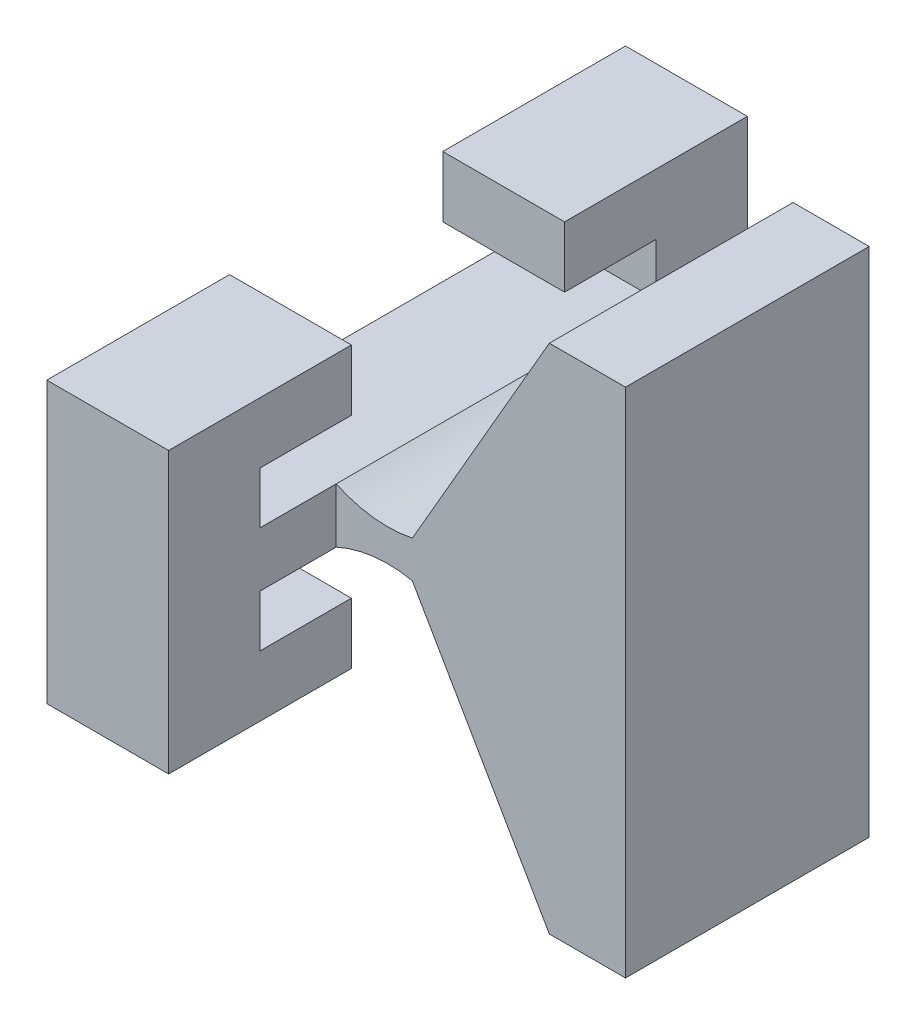
ISO-10303-21;
HEADER;
FILE_DESCRIPTION(('STEP AP214'),'2;1');
FILE_NAME('part.step','',(''),(''),'','','');
FILE_SCHEMA(('AUTOMOTIVE_DESIGN { 1 0 10303 214 1 1 1 1 }'));
ENDSEC;
DATA;
#1=APPLICATION_CONTEXT('core data for automotive mechanical design processes');
#2=APPLICATION_PROTOCOL_DEFINITION('international standard','automotive_design',2000,#1);
#3=PRODUCT_CONTEXT('',#1,'mechanical');
#4=PRODUCT('Part','Part','',(#3));
#5=PRODUCT_RELATED_PRODUCT_CATEGORY('part','',(#4));
#6=PRODUCT_DEFINITION_FORMATION('','',#4);
#7=PRODUCT_DEFINITION_CONTEXT('part definition',#1,'design');
#8=PRODUCT_DEFINITION('design','',#6,#7);
#9=PRODUCT_DEFINITION_SHAPE('','',#8);
#10=(LENGTH_UNIT() NAMED_UNIT(*) SI_UNIT(.MILLI.,.METRE.));
#11=(NAMED_UNIT(*) PLANE_ANGLE_UNIT() SI_UNIT($,.RADIAN.));
#12=(NAMED_UNIT(*) SI_UNIT($,.STERADIAN.) SOLID_ANGLE_UNIT());
#13=UNCERTAINTY_MEASURE_WITH_UNIT(LENGTH_MEASURE(1.E-05),#10,'distance_accuracy_value','');
#14=(GEOMETRIC_REPRESENTATION_CONTEXT(3) GLOBAL_UNCERTAINTY_ASSIGNED_CONTEXT((#13)) GLOBAL_UNIT_ASSIGNED_CONTEXT((#10,
#11,#12)) REPRESENTATION_CONTEXT('',''));
#15=CARTESIAN_POINT('',(0.,0.,0.));
#16=DIRECTION('',(0.,0.,1.));
#17=DIRECTION('',(1.,0.,0.));
#18=AXIS2_PLACEMENT_3D('',#15,#16,#17);
#19=CARTESIAN_POINT('',(0.,-4.6,-6.5));
#20=DIRECTION('',(0.,0.,1.));
#21=DIRECTION('',(1.,0.,0.));
#22=AXIS2_PLACEMENT_3D('',#19,#20,#21);
#23=PLANE('',#22);
#24=DIRECTION('',(0.,1.,0.));
#25=VECTOR('',#24,1.);
#26=CARTESIAN_POINT('',(0.,-4.6,-6.5));
#27=LINE('',#26,#25);
#28=CARTESIAN_POINT('',(0.,-2.6,-6.5));
#29=VERTEX_POINT('',#28);
#30=CARTESIAN_POINT('',(0.,-0.9,-6.5));
#31=VERTEX_POINT('',#30);
#32=EDGE_CURVE('E59',#29,#31,#27,.T.);
#33=ORIENTED_EDGE('',*,*,#32,.F.);
#34=DIRECTION('',(-1.,0.,0.));
#35=VECTOR('',#34,1.);
#36=CARTESIAN_POINT('',(4.,-2.6,-6.5));
#37=LINE('',#36,#35);
#38=CARTESIAN_POINT('',(4.,-2.6,-6.5));
#39=VERTEX_POINT('',#38);
#40=EDGE_CURVE('E54',#39,#29,#37,.T.);
#41=ORIENTED_EDGE('',*,*,#40,.F.);
#42=DIRECTION('',(0.,1.,0.));
#43=VECTOR('',#42,1.);
#44=CARTESIAN_POINT('',(4.,-4.6,-6.5));
#45=LINE('',#44,#43);
#46=CARTESIAN_POINT('',(4.,-0.9,-6.5));
#47=VERTEX_POINT('',#46);
#48=EDGE_CURVE('E363',#39,#47,#45,.T.);
#49=ORIENTED_EDGE('',*,*,#48,.T.);
#50=DIRECTION('',(1.,0.,0.));
#51=VECTOR('',#50,1.);
#52=CARTESIAN_POINT('',(0.,-0.9,-6.5));
#53=LINE('',#52,#51);
#54=EDGE_CURVE('E346',#31,#47,#53,.T.);
#55=ORIENTED_EDGE('',*,*,#54,.F.);
#56=EDGE_LOOP('',(#33,#41,#49,#55));
#57=FACE_BOUND('',#56,.T.);
#58=ADVANCED_FACE('F38',(#57),#23,.T.);
#59=CARTESIAN_POINT('',(0.,4.6,6.5));
#60=DIRECTION('',(0.,0.,-1.));
#61=DIRECTION('',(-1.,0.,0.));
#62=AXIS2_PLACEMENT_3D('',#59,#60,#61);
#63=PLANE('',#62);
#64=DIRECTION('',(0.,-1.,0.));
#65=VECTOR('',#64,1.);
#66=CARTESIAN_POINT('',(0.,4.6,6.5));
#67=LINE('',#66,#65);
#68=CARTESIAN_POINT('',(0.,2.6,6.5));
#69=VERTEX_POINT('',#68);
#70=CARTESIAN_POINT('',(0.,0.9,6.5));
#71=VERTEX_POINT('',#70);
#72=EDGE_CURVE('E391',#69,#71,#67,.T.);
#73=ORIENTED_EDGE('',*,*,#72,.F.);
#74=DIRECTION('',(-1.,0.,0.));
#75=VECTOR('',#74,1.);
#76=CARTESIAN_POINT('',(4.,2.6,6.5));
#77=LINE('',#76,#75);
#78=CARTESIAN_POINT('',(4.,2.6,6.5));
#79=VERTEX_POINT('',#78);
#80=EDGE_CURVE('E321',#79,#69,#77,.T.);
#81=ORIENTED_EDGE('',*,*,#80,.F.);
#82=DIRECTION('',(0.,-1.,0.));
#83=VECTOR('',#82,1.);
#84=CARTESIAN_POINT('',(4.,4.6,6.5));
#85=LINE('',#84,#83);
#86=CARTESIAN_POINT('',(4.,0.9,6.5));
#87=VERTEX_POINT('',#86);
#88=EDGE_CURVE('E397',#79,#87,#85,.T.);
#89=ORIENTED_EDGE('',*,*,#88,.T.);
#90=DIRECTION('',(1.,0.,0.));
#91=VECTOR('',#90,1.);
#92=CARTESIAN_POINT('',(0.,0.9,6.5));
#93=LINE('',#92,#91);
#94=EDGE_CURVE('E380',#71,#87,#93,.T.);
#95=ORIENTED_EDGE('',*,*,#94,.F.);
#96=EDGE_LOOP('',(#73,#81,#89,#95));
#97=FACE_BOUND('',#96,.T.);
#98=ADVANCED_FACE('F591',(#97),#63,.T.);
#99=CARTESIAN_POINT('',(0.,-0.9,4.));
#100=DIRECTION('',(0.,1.,0.));
#101=DIRECTION('',(0.,0.,1.));
#102=AXIS2_PLACEMENT_3D('',#99,#100,#101);
#103=PLANE('',#102);
#104=DIRECTION('',(0.,0.,-1.));
#105=VECTOR('',#104,1.);
#106=CARTESIAN_POINT('',(0.,-0.9,4.));
#107=LINE('',#106,#105);
#108=CARTESIAN_POINT('',(0.,-0.9,6.5));
#109=VERTEX_POINT('',#108);
#110=EDGE_CURVE('E11',#109,#31,#107,.T.);
#111=ORIENTED_EDGE('',*,*,#110,.T.);
#112=ORIENTED_EDGE('',*,*,#54,.T.);
#113=DIRECTION('',(0.,0.,1.));
#114=VECTOR('',#113,1.);
#115=CARTESIAN_POINT('',(4.,-0.9,-9.5));
#116=LINE('',#115,#114);
#117=CARTESIAN_POINT('',(4.,-0.9,-4.));
#118=VERTEX_POINT('',#117);
#119=EDGE_CURVE('E443',#47,#118,#116,.T.);
#120=ORIENTED_EDGE('',*,*,#119,.T.);
#121=DIRECTION('',(0.,0.,-1.));
#122=VECTOR('',#121,1.);
#123=CARTESIAN_POINT('',(4.,-0.899999999999999,4.));
#124=LINE('',#123,#122);
#125=CARTESIAN_POINT('',(4.,-0.899999999999999,4.));
#126=VERTEX_POINT('',#125);
#127=EDGE_CURVE('E47',#126,#118,#124,.T.);
#128=ORIENTED_EDGE('',*,*,#127,.F.);
#129=DIRECTION('',(0.,0.,-1.));
#130=VECTOR('',#129,1.);
#131=CARTESIAN_POINT('',(4.,-0.9,9.5));
#132=LINE('',#131,#130);
#133=CARTESIAN_POINT('',(4.,-0.9,6.5));
#134=VERTEX_POINT('',#133);
#135=EDGE_CURVE('E433',#134,#126,#132,.T.);
#136=ORIENTED_EDGE('',*,*,#135,.F.);
#137=DIRECTION('',(1.,0.,0.));
#138=VECTOR('',#137,1.);
#139=CARTESIAN_POINT('',(0.,-0.9,6.5));
#140=LINE('',#139,#138);
#141=EDGE_CURVE('E366',#109,#134,#140,.T.);
#142=ORIENTED_EDGE('',*,*,#141,.F.);
#143=EDGE_LOOP('',(#111,#112,#120,#128,#136,#142));
#144=FACE_BOUND('',#143,.T.);
#145=ADVANCED_FACE('F40',(#144),#103,.F.);
#146=CARTESIAN_POINT('',(0.,0.9,4.));
#147=DIRECTION('',(0.,-1.,0.));
#148=DIRECTION('',(0.,0.,-1.));
#149=AXIS2_PLACEMENT_3D('',#146,#147,#148);
#150=PLANE('',#149);
#151=DIRECTION('',(0.,0.,-1.));
#152=VECTOR('',#151,1.);
#153=CARTESIAN_POINT('',(0.,0.9,4.));
#154=LINE('',#153,#152);
#155=CARTESIAN_POINT('',(0.,0.9,-6.5));
#156=VERTEX_POINT('',#155);
#157=EDGE_CURVE('E476',#71,#156,#154,.T.);
#158=ORIENTED_EDGE('',*,*,#157,.F.);
#159=ORIENTED_EDGE('',*,*,#94,.T.);
#160=DIRECTION('',(0.,0.,-1.));
#161=VECTOR('',#160,1.);
#162=CARTESIAN_POINT('',(4.,0.9,9.5));
#163=LINE('',#162,#161);
#164=CARTESIAN_POINT('',(4.,0.9,4.));
#165=VERTEX_POINT('',#164);
#166=EDGE_CURVE('E427',#87,#165,#163,.T.);
#167=ORIENTED_EDGE('',*,*,#166,.T.);
#168=DIRECTION('',(0.,0.,-1.));
#169=VECTOR('',#168,1.);
#170=CARTESIAN_POINT('',(4.,0.9,4.));
#171=LINE('',#170,#169);
#172=CARTESIAN_POINT('',(4.,0.9,-4.));
#173=VERTEX_POINT('',#172);
#174=EDGE_CURVE('E500',#165,#173,#171,.T.);
#175=ORIENTED_EDGE('',*,*,#174,.T.);
#176=DIRECTION('',(0.,0.,1.));
#177=VECTOR('',#176,1.);
#178=CARTESIAN_POINT('',(4.,0.9,-9.5));
#179=LINE('',#178,#177);
#180=CARTESIAN_POINT('',(4.,0.9,-6.5));
#181=VERTEX_POINT('',#180);
#182=EDGE_CURVE('E449',#181,#173,#179,.T.);
#183=ORIENTED_EDGE('',*,*,#182,.F.);
#184=DIRECTION('',(1.,0.,0.));
#185=VECTOR('',#184,1.);
#186=CARTESIAN_POINT('',(0.,0.9,-6.5));
#187=LINE('',#186,#185);
#188=EDGE_CURVE('E400',#156,#181,#187,.T.);
#189=ORIENTED_EDGE('',*,*,#188,.F.);
#190=EDGE_LOOP('',(#158,#159,#167,#175,#183,#189));
#191=FACE_BOUND('',#190,.T.);
#192=ADVANCED_FACE('F554',(#191),#150,.F.);
#193=CARTESIAN_POINT('',(5.69379053843573,-4.52368232767521,4.));
#194=DIRECTION('',(0.,0.,1.));
#195=DIRECTION('',(1.,0.,0.));
#196=AXIS2_PLACEMENT_3D('',#193,#194,#195);
#197=PLANE('',#196);
#198=CARTESIAN_POINT('',(5.69379053843573,4.52368232767521,4.));
#199=DIRECTION('',(0.,0.,-1.));
#200=DIRECTION('',(-1.,0.,0.));
#201=AXIS2_PLACEMENT_3D('',#198,#199,#200);
#202=CIRCLE('',#201,4.);
#203=CARTESIAN_POINT('',(6.49999999999996,0.605771365940076,4.));
#204=VERTEX_POINT('',#203);
#205=EDGE_CURVE('E472',#204,#165,#202,.T.);
#206=ORIENTED_EDGE('',*,*,#205,.T.);
#207=DIRECTION('',(0.,-1.,0.));
#208=VECTOR('',#207,1.);
#209=CARTESIAN_POINT('',(4.,-0.9,4.));
#210=LINE('',#209,#208);
#211=EDGE_CURVE('E421',#165,#126,#210,.T.);
#212=ORIENTED_EDGE('',*,*,#211,.T.);
#213=CARTESIAN_POINT('',(5.69379053843573,-4.52368232767521,4.));
#214=DIRECTION('',(0.,0.,-1.));
#215=DIRECTION('',(1.,0.,0.));
#216=AXIS2_PLACEMENT_3D('',#213,#214,#215);
#217=CIRCLE('',#216,4.);
#218=CARTESIAN_POINT('',(6.49999999999996,-0.605771365940074,4.));
#219=VERTEX_POINT('',#218);
#220=EDGE_CURVE('E453',#126,#219,#217,.T.);
#221=ORIENTED_EDGE('',*,*,#220,.T.);
#222=DIRECTION('',(0.500000000000004,-0.866025403784436,0.));
#223=VECTOR('',#222,1.);
#224=CARTESIAN_POINT('',(11.,-8.4,4.));
#225=LINE('',#224,#223);
#226=CARTESIAN_POINT('',(11.,-8.4,4.));
#227=VERTEX_POINT('',#226);
#228=EDGE_CURVE('E456',#219,#227,#225,.T.);
#229=ORIENTED_EDGE('',*,*,#228,.T.);
#230=DIRECTION('',(1.,0.,0.));
#231=VECTOR('',#230,1.);
#232=CARTESIAN_POINT('',(11.,-8.4,4.));
#233=LINE('',#232,#231);
#234=CARTESIAN_POINT('',(13.5,-8.4,4.));
#235=VERTEX_POINT('',#234);
#236=EDGE_CURVE('E460',#227,#235,#233,.T.);
#237=ORIENTED_EDGE('',*,*,#236,.T.);
#238=DIRECTION('',(0.,1.,0.));
#239=VECTOR('',#238,1.);
#240=CARTESIAN_POINT('',(13.5,8.4,4.));
#241=LINE('',#240,#239);
#242=CARTESIAN_POINT('',(13.5,8.4,4.));
#243=VERTEX_POINT('',#242);
#244=EDGE_CURVE('E463',#235,#243,#241,.T.);
#245=ORIENTED_EDGE('',*,*,#244,.T.);
#246=DIRECTION('',(-1.,0.,0.));
#247=VECTOR('',#246,1.);
#248=CARTESIAN_POINT('',(11.,8.4,4.));
#249=LINE('',#248,#247);
#250=CARTESIAN_POINT('',(11.,8.4,4.));
#251=VERTEX_POINT('',#250);
#252=EDGE_CURVE('E466',#243,#251,#249,.T.);
#253=ORIENTED_EDGE('',*,*,#252,.T.);
#254=DIRECTION('',(-0.500000000000004,-0.866025403784436,0.));
#255=VECTOR('',#254,1.);
#256=CARTESIAN_POINT('',(11.,8.4,4.));
#257=LINE('',#256,#255);
#258=EDGE_CURVE('E469',#251,#204,#257,.T.);
#259=ORIENTED_EDGE('',*,*,#258,.T.);
#260=EDGE_LOOP('',(#206,#212,#221,#229,#237,#245,#253,#259));
#261=FACE_BOUND('',#260,.T.);
#262=ADVANCED_FACE('F560',(#261),#197,.T.);
#263=CARTESIAN_POINT('',(5.69379053843573,-4.52368232767521,-4.));
#264=DIRECTION('',(0.,0.,1.));
#265=DIRECTION('',(1.,0.,0.));
#266=AXIS2_PLACEMENT_3D('',#263,#264,#265);
#267=PLANE('',#266);
#268=DIRECTION('',(0.,-1.,0.));
#269=VECTOR('',#268,1.);
#270=CARTESIAN_POINT('',(4.,-0.9,-4.));
#271=LINE('',#270,#269);
#272=EDGE_CURVE('E436',#173,#118,#271,.T.);
#273=ORIENTED_EDGE('',*,*,#272,.F.);
#274=CARTESIAN_POINT('',(5.69379053843573,4.52368232767521,-4.));
#275=DIRECTION('',(0.,0.,-1.));
#276=DIRECTION('',(-1.,0.,0.));
#277=AXIS2_PLACEMENT_3D('',#274,#275,#276);
#278=CIRCLE('',#277,4.);
#279=CARTESIAN_POINT('',(6.49999999999996,0.605771365940076,-4.));
#280=VERTEX_POINT('',#279);
#281=EDGE_CURVE('E457',#280,#173,#278,.T.);
#282=ORIENTED_EDGE('',*,*,#281,.F.);
#283=DIRECTION('',(-0.500000000000004,-0.866025403784436,0.));
#284=VECTOR('',#283,1.);
#285=CARTESIAN_POINT('',(11.,8.4,-4.));
#286=LINE('',#285,#284);
#287=CARTESIAN_POINT('',(11.,8.4,-4.));
#288=VERTEX_POINT('',#287);
#289=EDGE_CURVE('E491',#288,#280,#286,.T.);
#290=ORIENTED_EDGE('',*,*,#289,.F.);
#291=DIRECTION('',(-1.,0.,0.));
#292=VECTOR('',#291,1.);
#293=CARTESIAN_POINT('',(11.,8.4,-4.));
#294=LINE('',#293,#292);
#295=CARTESIAN_POINT('',(13.5,8.4,-4.));
#296=VERTEX_POINT('',#295);
#297=EDGE_CURVE('E488',#296,#288,#294,.T.);
#298=ORIENTED_EDGE('',*,*,#297,.F.);
#299=DIRECTION('',(0.,1.,0.));
#300=VECTOR('',#299,1.);
#301=CARTESIAN_POINT('',(13.5,8.4,-4.));
#302=LINE('',#301,#300);
#303=CARTESIAN_POINT('',(13.5,-8.4,-4.));
#304=VERTEX_POINT('',#303);
#305=EDGE_CURVE('E485',#304,#296,#302,.T.);
#306=ORIENTED_EDGE('',*,*,#305,.F.);
#307=DIRECTION('',(1.,0.,0.));
#308=VECTOR('',#307,1.);
#309=CARTESIAN_POINT('',(11.,-8.4,-4.));
#310=LINE('',#309,#308);
#311=CARTESIAN_POINT('',(11.,-8.4,-4.));
#312=VERTEX_POINT('',#311);
#313=EDGE_CURVE('E482',#312,#304,#310,.T.);
#314=ORIENTED_EDGE('',*,*,#313,.F.);
#315=DIRECTION('',(0.500000000000004,-0.866025403784436,0.));
#316=VECTOR('',#315,1.);
#317=CARTESIAN_POINT('',(11.,-8.4,-4.));
#318=LINE('',#317,#316);
#319=CARTESIAN_POINT('',(6.49999999999996,-0.605771365940074,-4.));
#320=VERTEX_POINT('',#319);
#321=EDGE_CURVE('E479',#320,#312,#318,.T.);
#322=ORIENTED_EDGE('',*,*,#321,.F.);
#323=CARTESIAN_POINT('',(5.69379053843573,-4.52368232767521,-4.));
#324=DIRECTION('',(0.,0.,-1.));
#325=DIRECTION('',(1.,0.,0.));
#326=AXIS2_PLACEMENT_3D('',#323,#324,#325);
#327=CIRCLE('',#326,4.);
#328=EDGE_CURVE('E452',#118,#320,#327,.T.);
#329=ORIENTED_EDGE('',*,*,#328,.F.);
#330=EDGE_LOOP('',(#273,#282,#290,#298,#306,#314,#322,#329));
#331=FACE_BOUND('',#330,.T.);
#332=ADVANCED_FACE('F544',(#331),#267,.F.);
#333=CARTESIAN_POINT('',(5.69379053843573,-4.52368232767521,4.));
#334=DIRECTION('',(0.,0.,-1.));
#335=DIRECTION('',(-1.,0.,0.));
#336=AXIS2_PLACEMENT_3D('',#333,#334,#335);
#337=CYLINDRICAL_SURFACE('',#336,4.);
#338=ORIENTED_EDGE('',*,*,#328,.T.);
#339=DIRECTION('',(0.,0.,-1.));
#340=VECTOR('',#339,1.);
#341=CARTESIAN_POINT('',(6.49999999999996,-0.605771365940074,4.));
#342=LINE('',#341,#340);
#343=EDGE_CURVE('E524',#219,#320,#342,.T.);
#344=ORIENTED_EDGE('',*,*,#343,.F.);
#345=ORIENTED_EDGE('',*,*,#220,.F.);
#346=ORIENTED_EDGE('',*,*,#127,.T.);
#347=EDGE_LOOP('',(#338,#344,#345,#346));
#348=FACE_BOUND('',#347,.T.);
#349=ADVANCED_FACE('F532',(#348),#337,.F.);
#350=CARTESIAN_POINT('',(11.,-8.4,4.));
#351=DIRECTION('',(0.866025403784436,0.500000000000004,0.));
#352=DIRECTION('',(-0.500000000000004,0.866025403784436,0.));
#353=AXIS2_PLACEMENT_3D('',#350,#351,#352);
#354=PLANE('',#353);
#355=ORIENTED_EDGE('',*,*,#321,.T.);
#356=DIRECTION('',(0.,0.,-1.));
#357=VECTOR('',#356,1.);
#358=CARTESIAN_POINT('',(11.,-8.4,4.));
#359=LINE('',#358,#357);
#360=EDGE_CURVE('E520',#227,#312,#359,.T.);
#361=ORIENTED_EDGE('',*,*,#360,.F.);
#362=ORIENTED_EDGE('',*,*,#228,.F.);
#363=ORIENTED_EDGE('',*,*,#343,.T.);
#364=EDGE_LOOP('',(#355,#361,#362,#363));
#365=FACE_BOUND('',#364,.T.);
#366=ADVANCED_FACE('F581',(#365),#354,.F.);
#367=CARTESIAN_POINT('',(11.,-8.4,4.));
#368=DIRECTION('',(0.,1.,0.));
#369=DIRECTION('',(0.,0.,1.));
#370=AXIS2_PLACEMENT_3D('',#367,#368,#369);
#371=PLANE('',#370);
#372=ORIENTED_EDGE('',*,*,#313,.T.);
#373=DIRECTION('',(0.,0.,-1.));
#374=VECTOR('',#373,1.);
#375=CARTESIAN_POINT('',(13.5,-8.4,4.));
#376=LINE('',#375,#374);
#377=EDGE_CURVE('E516',#235,#304,#376,.T.);
#378=ORIENTED_EDGE('',*,*,#377,.F.);
#379=ORIENTED_EDGE('',*,*,#236,.F.);
#380=ORIENTED_EDGE('',*,*,#360,.T.);
#381=EDGE_LOOP('',(#372,#378,#379,#380));
#382=FACE_BOUND('',#381,.T.);
#383=ADVANCED_FACE('F578',(#382),#371,.F.);
#384=CARTESIAN_POINT('',(13.5,8.4,4.));
#385=DIRECTION('',(-1.,0.,0.));
#386=DIRECTION('',(0.,0.,1.));
#387=AXIS2_PLACEMENT_3D('',#384,#385,#386);
#388=PLANE('',#387);
#389=ORIENTED_EDGE('',*,*,#305,.T.);
#390=DIRECTION('',(0.,0.,-1.));
#391=VECTOR('',#390,1.);
#392=CARTESIAN_POINT('',(13.5,8.4,4.));
#393=LINE('',#392,#391);
#394=EDGE_CURVE('E512',#243,#296,#393,.T.);
#395=ORIENTED_EDGE('',*,*,#394,.F.);
#396=ORIENTED_EDGE('',*,*,#244,.F.);
#397=ORIENTED_EDGE('',*,*,#377,.T.);
#398=EDGE_LOOP('',(#389,#395,#396,#397));
#399=FACE_BOUND('',#398,.T.);
#400=ADVANCED_FACE('F574',(#399),#388,.F.);
#401=CARTESIAN_POINT('',(11.,8.4,4.));
#402=DIRECTION('',(0.,-1.,0.));
#403=DIRECTION('',(0.,0.,-1.));
#404=AXIS2_PLACEMENT_3D('',#401,#402,#403);
#405=PLANE('',#404);
#406=ORIENTED_EDGE('',*,*,#297,.T.);
#407=DIRECTION('',(0.,0.,-1.));
#408=VECTOR('',#407,1.);
#409=CARTESIAN_POINT('',(11.,8.4,4.));
#410=LINE('',#409,#408);
#411=EDGE_CURVE('E508',#251,#288,#410,.T.);
#412=ORIENTED_EDGE('',*,*,#411,.F.);
#413=ORIENTED_EDGE('',*,*,#252,.F.);
#414=ORIENTED_EDGE('',*,*,#394,.T.);
#415=EDGE_LOOP('',(#406,#412,#413,#414));
#416=FACE_BOUND('',#415,.T.);
#417=ADVANCED_FACE('F570',(#416),#405,.F.);
#418=CARTESIAN_POINT('',(11.,8.4,4.));
#419=DIRECTION('',(0.866025403784436,-0.500000000000004,0.));
#420=DIRECTION('',(0.500000000000004,0.866025403784436,0.));
#421=AXIS2_PLACEMENT_3D('',#418,#419,#420);
#422=PLANE('',#421);
#423=ORIENTED_EDGE('',*,*,#289,.T.);
#424=DIRECTION('',(0.,0.,-1.));
#425=VECTOR('',#424,1.);
#426=CARTESIAN_POINT('',(6.49999999999996,0.605771365940076,4.));
#427=LINE('',#426,#425);
#428=EDGE_CURVE('E504',#204,#280,#427,.T.);
#429=ORIENTED_EDGE('',*,*,#428,.F.);
#430=ORIENTED_EDGE('',*,*,#258,.F.);
#431=ORIENTED_EDGE('',*,*,#411,.T.);
#432=EDGE_LOOP('',(#423,#429,#430,#431));
#433=FACE_BOUND('',#432,.T.);
#434=ADVANCED_FACE('F565',(#433),#422,.F.);
#435=CARTESIAN_POINT('',(5.69379053843573,4.52368232767521,4.));
#436=DIRECTION('',(0.,0.,-1.));
#437=DIRECTION('',(-1.,0.,0.));
#438=AXIS2_PLACEMENT_3D('',#435,#436,#437);
#439=CYLINDRICAL_SURFACE('',#438,4.);
#440=ORIENTED_EDGE('',*,*,#281,.T.);
#441=ORIENTED_EDGE('',*,*,#174,.F.);
#442=ORIENTED_EDGE('',*,*,#205,.F.);
#443=ORIENTED_EDGE('',*,*,#428,.T.);
#444=EDGE_LOOP('',(#440,#441,#442,#443));
#445=FACE_BOUND('',#444,.T.);
#446=ADVANCED_FACE('F549',(#445),#439,.F.);
#447=CARTESIAN_POINT('',(0.,0.,4.));
#448=DIRECTION('',(1.,0.,0.));
#449=DIRECTION('',(0.,0.,-1.));
#450=AXIS2_PLACEMENT_3D('',#447,#448,#449);
#451=PLANE('',#450);
#452=DIRECTION('',(0.,1.,0.));
#453=VECTOR('',#452,1.);
#454=CARTESIAN_POINT('',(0.,-0.9,9.5));
#455=LINE('',#454,#453);
#456=CARTESIAN_POINT('',(0.,-4.6,9.5));
#457=VERTEX_POINT('',#456);
#458=CARTESIAN_POINT('',(0.,4.6,9.5));
#459=VERTEX_POINT('',#458);
#460=EDGE_CURVE('E422',#457,#459,#455,.T.);
#461=ORIENTED_EDGE('',*,*,#460,.T.);
#462=DIRECTION('',(0.,0.,-1.));
#463=VECTOR('',#462,1.);
#464=CARTESIAN_POINT('',(0.,4.6,9.5));
#465=LINE('',#464,#463);
#466=CARTESIAN_POINT('',(0.,4.6,3.5));
#467=VERTEX_POINT('',#466);
#468=EDGE_CURVE('E381',#459,#467,#465,.T.);
#469=ORIENTED_EDGE('',*,*,#468,.T.);
#470=DIRECTION('',(0.,1.,0.));
#471=VECTOR('',#470,1.);
#472=CARTESIAN_POINT('',(0.,4.6,3.5));
#473=LINE('',#472,#471);
#474=CARTESIAN_POINT('',(0.,2.6,3.5));
#475=VERTEX_POINT('',#474);
#476=EDGE_CURVE('E327',#475,#467,#473,.T.);
#477=ORIENTED_EDGE('',*,*,#476,.F.);
#478=DIRECTION('',(0.,0.,1.));
#479=VECTOR('',#478,1.);
#480=CARTESIAN_POINT('',(0.,2.6,3.5));
#481=LINE('',#480,#479);
#482=EDGE_CURVE('E335',#475,#69,#481,.T.);
#483=ORIENTED_EDGE('',*,*,#482,.T.);
#484=ORIENTED_EDGE('',*,*,#72,.T.);
#485=ORIENTED_EDGE('',*,*,#157,.T.);
#486=DIRECTION('',(0.,-1.,0.));
#487=VECTOR('',#486,1.);
#488=CARTESIAN_POINT('',(0.,4.6,-6.5));
#489=LINE('',#488,#487);
#490=CARTESIAN_POINT('',(0.,2.6,-6.5));
#491=VERTEX_POINT('',#490);
#492=EDGE_CURVE('E418',#491,#156,#489,.T.);
#493=ORIENTED_EDGE('',*,*,#492,.F.);
#494=DIRECTION('',(0.,0.,-1.));
#495=VECTOR('',#494,1.);
#496=CARTESIAN_POINT('',(0.,2.6,-3.5));
#497=LINE('',#496,#495);
#498=CARTESIAN_POINT('',(0.,2.6,-3.5));
#499=VERTEX_POINT('',#498);
#500=EDGE_CURVE('E318',#499,#491,#497,.T.);
#501=ORIENTED_EDGE('',*,*,#500,.F.);
#502=DIRECTION('',(0.,1.,0.));
#503=VECTOR('',#502,1.);
#504=CARTESIAN_POINT('',(0.,4.6,-3.5));
#505=LINE('',#504,#503);
#506=CARTESIAN_POINT('',(0.,4.6,-3.5));
#507=VERTEX_POINT('',#506);
#508=EDGE_CURVE('E304',#499,#507,#505,.T.);
#509=ORIENTED_EDGE('',*,*,#508,.T.);
#510=DIRECTION('',(0.,0.,1.));
#511=VECTOR('',#510,1.);
#512=CARTESIAN_POINT('',(0.,4.6,-9.5));
#513=LINE('',#512,#511);
#514=CARTESIAN_POINT('',(0.,4.6,-9.5));
#515=VERTEX_POINT('',#514);
#516=EDGE_CURVE('E401',#515,#507,#513,.T.);
#517=ORIENTED_EDGE('',*,*,#516,.F.);
#518=DIRECTION('',(0.,1.,0.));
#519=VECTOR('',#518,1.);
#520=CARTESIAN_POINT('',(0.,-0.9,-9.5));
#521=LINE('',#520,#519);
#522=CARTESIAN_POINT('',(0.,-4.6,-9.5));
#523=VERTEX_POINT('',#522);
#524=EDGE_CURVE('E437',#523,#515,#521,.T.);
#525=ORIENTED_EDGE('',*,*,#524,.F.);
#526=DIRECTION('',(0.,0.,1.));
#527=VECTOR('',#526,1.);
#528=CARTESIAN_POINT('',(0.,-4.6,-9.5));
#529=LINE('',#528,#527);
#530=CARTESIAN_POINT('',(0.,-4.6,-3.5));
#531=VERTEX_POINT('',#530);
#532=EDGE_CURVE('E347',#523,#531,#529,.T.);
#533=ORIENTED_EDGE('',*,*,#532,.T.);
#534=DIRECTION('',(0.,-1.,0.));
#535=VECTOR('',#534,1.);
#536=CARTESIAN_POINT('',(0.,-4.6,-3.5));
#537=LINE('',#536,#535);
#538=CARTESIAN_POINT('',(0.,-2.6,-3.5));
#539=VERTEX_POINT('',#538);
#540=EDGE_CURVE('E277',#539,#531,#537,.T.);
#541=ORIENTED_EDGE('',*,*,#540,.F.);
#542=DIRECTION('',(0.,0.,-1.));
#543=VECTOR('',#542,1.);
#544=CARTESIAN_POINT('',(0.,-2.6,-3.5));
#545=LINE('',#544,#543);
#546=EDGE_CURVE('E285',#539,#29,#545,.T.);
#547=ORIENTED_EDGE('',*,*,#546,.T.);
#548=ORIENTED_EDGE('',*,*,#32,.T.);
#549=ORIENTED_EDGE('',*,*,#110,.F.);
#550=DIRECTION('',(0.,1.,0.));
#551=VECTOR('',#550,1.);
#552=CARTESIAN_POINT('',(0.,-4.6,6.5));
#553=LINE('',#552,#551);
#554=CARTESIAN_POINT('',(0.,-2.6,6.5));
#555=VERTEX_POINT('',#554);
#556=EDGE_CURVE('E377',#555,#109,#553,.T.);
#557=ORIENTED_EDGE('',*,*,#556,.F.);
#558=DIRECTION('',(0.,0.,1.));
#559=VECTOR('',#558,1.);
#560=CARTESIAN_POINT('',(0.,-2.6,3.5));
#561=LINE('',#560,#559);
#562=CARTESIAN_POINT('',(0.,-2.6,3.5));
#563=VERTEX_POINT('',#562);
#564=EDGE_CURVE('E267',#563,#555,#561,.T.);
#565=ORIENTED_EDGE('',*,*,#564,.F.);
#566=DIRECTION('',(0.,-1.,0.));
#567=VECTOR('',#566,1.);
#568=CARTESIAN_POINT('',(0.,-4.6,3.5));
#569=LINE('',#568,#567);
#570=CARTESIAN_POINT('',(0.,-4.6,3.5));
#571=VERTEX_POINT('',#570);
#572=EDGE_CURVE('E252',#563,#571,#569,.T.);
#573=ORIENTED_EDGE('',*,*,#572,.T.);
#574=DIRECTION('',(0.,0.,-1.));
#575=VECTOR('',#574,1.);
#576=CARTESIAN_POINT('',(0.,-4.6,9.5));
#577=LINE('',#576,#575);
#578=EDGE_CURVE('E236',#457,#571,#577,.T.);
#579=ORIENTED_EDGE('',*,*,#578,.F.);
#580=EDGE_LOOP('',(#461,#469,#477,#483,#484,#485,#493,#501,#509,#517,#525,#533,#541,#547,#548,
#549,#557,#565,#573,#579));
#581=FACE_BOUND('',#580,.T.);
#582=ADVANCED_FACE('F632',(#581),#451,.F.);
#583=CARTESIAN_POINT('',(4.,-0.9,-9.5));
#584=DIRECTION('',(-1.,0.,0.));
#585=DIRECTION('',(0.,0.,1.));
#586=AXIS2_PLACEMENT_3D('',#583,#584,#585);
#587=PLANE('',#586);
#588=ORIENTED_EDGE('',*,*,#272,.T.);
#589=ORIENTED_EDGE('',*,*,#119,.F.);
#590=ORIENTED_EDGE('',*,*,#48,.F.);
#591=DIRECTION('',(0.,0.,-1.));
#592=VECTOR('',#591,1.);
#593=CARTESIAN_POINT('',(4.,-2.6,-3.5));
#594=LINE('',#593,#592);
#595=CARTESIAN_POINT('',(4.,-2.6,-3.5));
#596=VERTEX_POINT('',#595);
#597=EDGE_CURVE('E291',#596,#39,#594,.T.);
#598=ORIENTED_EDGE('',*,*,#597,.F.);
#599=DIRECTION('',(0.,1.,0.));
#600=VECTOR('',#599,1.);
#601=CARTESIAN_POINT('',(4.,-4.6,-3.5));
#602=LINE('',#601,#600);
#603=CARTESIAN_POINT('',(4.,-4.6,-3.5));
#604=VERTEX_POINT('',#603);
#605=EDGE_CURVE('E270',#604,#596,#602,.T.);
#606=ORIENTED_EDGE('',*,*,#605,.F.);
#607=DIRECTION('',(0.,0.,-1.));
#608=VECTOR('',#607,1.);
#609=CARTESIAN_POINT('',(4.,-4.6,-9.5));
#610=LINE('',#609,#608);
#611=CARTESIAN_POINT('',(4.,-4.6,-9.5));
#612=VERTEX_POINT('',#611);
#613=EDGE_CURVE('E354',#604,#612,#610,.T.);
#614=ORIENTED_EDGE('',*,*,#613,.T.);
#615=DIRECTION('',(0.,-1.,0.));
#616=VECTOR('',#615,1.);
#617=CARTESIAN_POINT('',(4.,-0.9,-9.5));
#618=LINE('',#617,#616);
#619=CARTESIAN_POINT('',(4.,4.6,-9.5));
#620=VERTEX_POINT('',#619);
#621=EDGE_CURVE('E440',#620,#612,#618,.T.);
#622=ORIENTED_EDGE('',*,*,#621,.F.);
#623=DIRECTION('',(0.,0.,-1.));
#624=VECTOR('',#623,1.);
#625=CARTESIAN_POINT('',(4.,4.6,-9.5));
#626=LINE('',#625,#624);
#627=CARTESIAN_POINT('',(4.,4.6,-3.5));
#628=VERTEX_POINT('',#627);
#629=EDGE_CURVE('E404',#628,#620,#626,.T.);
#630=ORIENTED_EDGE('',*,*,#629,.F.);
#631=DIRECTION('',(0.,-1.,0.));
#632=VECTOR('',#631,1.);
#633=CARTESIAN_POINT('',(4.,4.6,-3.5));
#634=LINE('',#633,#632);
#635=CARTESIAN_POINT('',(4.,2.6,-3.5));
#636=VERTEX_POINT('',#635);
#637=EDGE_CURVE('E296',#628,#636,#634,.T.);
#638=ORIENTED_EDGE('',*,*,#637,.T.);
#639=DIRECTION('',(0.,0.,-1.));
#640=VECTOR('',#639,1.);
#641=CARTESIAN_POINT('',(4.,2.6,-3.5));
#642=LINE('',#641,#640);
#643=CARTESIAN_POINT('',(4.,2.6,-6.5));
#644=VERTEX_POINT('',#643);
#645=EDGE_CURVE('E312',#636,#644,#642,.T.);
#646=ORIENTED_EDGE('',*,*,#645,.T.);
#647=DIRECTION('',(0.,-1.,0.));
#648=VECTOR('',#647,1.);
#649=CARTESIAN_POINT('',(4.,4.6,-6.5));
#650=LINE('',#649,#648);
#651=EDGE_CURVE('E412',#644,#181,#650,.T.);
#652=ORIENTED_EDGE('',*,*,#651,.T.);
#653=ORIENTED_EDGE('',*,*,#182,.T.);
#654=EDGE_LOOP('',(#588,#589,#590,#598,#606,#614,#622,#630,#638,#646,#652,#653));
#655=FACE_BOUND('',#654,.T.);
#656=ADVANCED_FACE('F540',(#655),#587,.F.);
#657=CARTESIAN_POINT('',(0.,0.,-9.5));
#658=DIRECTION('',(0.,0.,-1.));
#659=DIRECTION('',(-1.,0.,0.));
#660=AXIS2_PLACEMENT_3D('',#657,#658,#659);
#661=PLANE('',#660);
#662=ORIENTED_EDGE('',*,*,#524,.T.);
#663=DIRECTION('',(-1.,0.,0.));
#664=VECTOR('',#663,1.);
#665=CARTESIAN_POINT('',(0.,4.6,-9.5));
#666=LINE('',#665,#664);
#667=EDGE_CURVE('E408',#620,#515,#666,.T.);
#668=ORIENTED_EDGE('',*,*,#667,.F.);
#669=ORIENTED_EDGE('',*,*,#621,.T.);
#670=DIRECTION('',(-1.,0.,0.));
#671=VECTOR('',#670,1.);
#672=CARTESIAN_POINT('',(0.,-4.6,-9.5));
#673=LINE('',#672,#671);
#674=EDGE_CURVE('E350',#612,#523,#673,.T.);
#675=ORIENTED_EDGE('',*,*,#674,.T.);
#676=EDGE_LOOP('',(#662,#668,#669,#675));
#677=FACE_BOUND('',#676,.T.);
#678=ADVANCED_FACE('F626',(#677),#661,.T.);
#679=CARTESIAN_POINT('',(4.,-0.9,9.5));
#680=DIRECTION('',(1.,0.,0.));
#681=DIRECTION('',(0.,0.,-1.));
#682=AXIS2_PLACEMENT_3D('',#679,#680,#681);
#683=PLANE('',#682);
#684=ORIENTED_EDGE('',*,*,#211,.F.);
#685=ORIENTED_EDGE('',*,*,#166,.F.);
#686=ORIENTED_EDGE('',*,*,#88,.F.);
#687=DIRECTION('',(0.,0.,1.));
#688=VECTOR('',#687,1.);
#689=CARTESIAN_POINT('',(4.,2.6,3.5));
#690=LINE('',#689,#688);
#691=CARTESIAN_POINT('',(4.,2.6,3.5));
#692=VERTEX_POINT('',#691);
#693=EDGE_CURVE('E342',#692,#79,#690,.T.);
#694=ORIENTED_EDGE('',*,*,#693,.F.);
#695=DIRECTION('',(0.,-1.,0.));
#696=VECTOR('',#695,1.);
#697=CARTESIAN_POINT('',(4.,4.6,3.5));
#698=LINE('',#697,#696);
#699=CARTESIAN_POINT('',(4.,4.6,3.5));
#700=VERTEX_POINT('',#699);
#701=EDGE_CURVE('E322',#700,#692,#698,.T.);
#702=ORIENTED_EDGE('',*,*,#701,.F.);
#703=DIRECTION('',(0.,0.,1.));
#704=VECTOR('',#703,1.);
#705=CARTESIAN_POINT('',(4.,4.6,9.5));
#706=LINE('',#705,#704);
#707=CARTESIAN_POINT('',(4.,4.6,9.5));
#708=VERTEX_POINT('',#707);
#709=EDGE_CURVE('E388',#700,#708,#706,.T.);
#710=ORIENTED_EDGE('',*,*,#709,.T.);
#711=DIRECTION('',(0.,-1.,0.));
#712=VECTOR('',#711,1.);
#713=CARTESIAN_POINT('',(4.,-0.9,9.5));
#714=LINE('',#713,#712);
#715=CARTESIAN_POINT('',(4.,-4.6,9.5));
#716=VERTEX_POINT('',#715);
#717=EDGE_CURVE('E229',#708,#716,#714,.T.);
#718=ORIENTED_EDGE('',*,*,#717,.T.);
#719=DIRECTION('',(0.,0.,1.));
#720=VECTOR('',#719,1.);
#721=CARTESIAN_POINT('',(4.,-4.6,9.5));
#722=LINE('',#721,#720);
#723=CARTESIAN_POINT('',(4.,-4.6,3.5));
#724=VERTEX_POINT('',#723);
#725=EDGE_CURVE('E222',#724,#716,#722,.T.);
#726=ORIENTED_EDGE('',*,*,#725,.F.);
#727=DIRECTION('',(0.,1.,0.));
#728=VECTOR('',#727,1.);
#729=CARTESIAN_POINT('',(4.,-4.6,3.5));
#730=LINE('',#729,#728);
#731=CARTESIAN_POINT('',(4.,-2.6,3.5));
#732=VERTEX_POINT('',#731);
#733=EDGE_CURVE('E226',#724,#732,#730,.T.);
#734=ORIENTED_EDGE('',*,*,#733,.T.);
#735=DIRECTION('',(0.,0.,1.));
#736=VECTOR('',#735,1.);
#737=CARTESIAN_POINT('',(4.,-2.6,3.5));
#738=LINE('',#737,#736);
#739=CARTESIAN_POINT('',(4.,-2.6,6.5));
#740=VERTEX_POINT('',#739);
#741=EDGE_CURVE('E261',#732,#740,#738,.T.);
#742=ORIENTED_EDGE('',*,*,#741,.T.);
#743=DIRECTION('',(0.,1.,0.));
#744=VECTOR('',#743,1.);
#745=CARTESIAN_POINT('',(4.,-4.6,6.5));
#746=LINE('',#745,#744);
#747=EDGE_CURVE('E371',#740,#134,#746,.T.);
#748=ORIENTED_EDGE('',*,*,#747,.T.);
#749=ORIENTED_EDGE('',*,*,#135,.T.);
#750=EDGE_LOOP('',(#684,#685,#686,#694,#702,#710,#718,#726,#734,#742,#748,#749));
#751=FACE_BOUND('',#750,.T.);
#752=ADVANCED_FACE('F225',(#751),#683,.T.);
#753=CARTESIAN_POINT('',(0.,0.,9.5));
#754=DIRECTION('',(0.,0.,1.));
#755=DIRECTION('',(-1.,0.,0.));
#756=AXIS2_PLACEMENT_3D('',#753,#754,#755);
#757=PLANE('',#756);
#758=ORIENTED_EDGE('',*,*,#460,.F.);
#759=DIRECTION('',(-1.,0.,0.));
#760=VECTOR('',#759,1.);
#761=CARTESIAN_POINT('',(0.,-4.6,9.5));
#762=LINE('',#761,#760);
#763=EDGE_CURVE('E235',#716,#457,#762,.T.);
#764=ORIENTED_EDGE('',*,*,#763,.F.);
#765=ORIENTED_EDGE('',*,*,#717,.F.);
#766=DIRECTION('',(-1.,0.,0.));
#767=VECTOR('',#766,1.);
#768=CARTESIAN_POINT('',(0.,4.6,9.5));
#769=LINE('',#768,#767);
#770=EDGE_CURVE('E384',#708,#459,#769,.T.);
#771=ORIENTED_EDGE('',*,*,#770,.T.);
#772=EDGE_LOOP('',(#758,#764,#765,#771));
#773=FACE_BOUND('',#772,.T.);
#774=ADVANCED_FACE('F619',(#773),#757,.T.);
#775=CARTESIAN_POINT('',(0.,4.6,-6.5));
#776=DIRECTION('',(0.,0.,-1.));
#777=DIRECTION('',(-1.,0.,0.));
#778=AXIS2_PLACEMENT_3D('',#775,#776,#777);
#779=PLANE('',#778);
#780=ORIENTED_EDGE('',*,*,#651,.F.);
#781=DIRECTION('',(-1.,0.,0.));
#782=VECTOR('',#781,1.);
#783=CARTESIAN_POINT('',(4.,2.6,-6.5));
#784=LINE('',#783,#782);
#785=EDGE_CURVE('E295',#644,#491,#784,.T.);
#786=ORIENTED_EDGE('',*,*,#785,.T.);
#787=ORIENTED_EDGE('',*,*,#492,.T.);
#788=ORIENTED_EDGE('',*,*,#188,.T.);
#789=EDGE_LOOP('',(#780,#786,#787,#788));
#790=FACE_BOUND('',#789,.T.);
#791=ADVANCED_FACE('F615',(#790),#779,.F.);
#792=CARTESIAN_POINT('',(0.,4.6,0.));
#793=DIRECTION('',(0.,1.,0.));
#794=DIRECTION('',(0.,0.,1.));
#795=AXIS2_PLACEMENT_3D('',#792,#793,#794);
#796=PLANE('',#795);
#797=ORIENTED_EDGE('',*,*,#516,.T.);
#798=DIRECTION('',(1.,0.,0.));
#799=VECTOR('',#798,1.);
#800=CARTESIAN_POINT('',(4.,4.6,-3.5));
#801=LINE('',#800,#799);
#802=EDGE_CURVE('E300',#507,#628,#801,.T.);
#803=ORIENTED_EDGE('',*,*,#802,.T.);
#804=ORIENTED_EDGE('',*,*,#629,.T.);
#805=ORIENTED_EDGE('',*,*,#667,.T.);
#806=EDGE_LOOP('',(#797,#803,#804,#805));
#807=FACE_BOUND('',#806,.T.);
#808=ADVANCED_FACE('F610',(#807),#796,.T.);
#809=CARTESIAN_POINT('',(0.,4.6,0.));
#810=DIRECTION('',(0.,1.,0.));
#811=DIRECTION('',(0.,0.,-1.));
#812=AXIS2_PLACEMENT_3D('',#809,#810,#811);
#813=PLANE('',#812);
#814=ORIENTED_EDGE('',*,*,#468,.F.);
#815=ORIENTED_EDGE('',*,*,#770,.F.);
#816=ORIENTED_EDGE('',*,*,#709,.F.);
#817=DIRECTION('',(1.,0.,0.));
#818=VECTOR('',#817,1.);
#819=CARTESIAN_POINT('',(4.,4.6,3.5));
#820=LINE('',#819,#818);
#821=EDGE_CURVE('E331',#467,#700,#820,.T.);
#822=ORIENTED_EDGE('',*,*,#821,.F.);
#823=EDGE_LOOP('',(#814,#815,#816,#822));
#824=FACE_BOUND('',#823,.T.);
#825=ADVANCED_FACE('F607',(#824),#813,.T.);
#826=CARTESIAN_POINT('',(0.,-4.6,6.5));
#827=DIRECTION('',(0.,0.,1.));
#828=DIRECTION('',(1.,0.,0.));
#829=AXIS2_PLACEMENT_3D('',#826,#827,#828);
#830=PLANE('',#829);
#831=ORIENTED_EDGE('',*,*,#747,.F.);
#832=DIRECTION('',(-1.,0.,0.));
#833=VECTOR('',#832,1.);
#834=CARTESIAN_POINT('',(4.,-2.6,6.5));
#835=LINE('',#834,#833);
#836=EDGE_CURVE('E247',#740,#555,#835,.T.);
#837=ORIENTED_EDGE('',*,*,#836,.T.);
#838=ORIENTED_EDGE('',*,*,#556,.T.);
#839=ORIENTED_EDGE('',*,*,#141,.T.);
#840=EDGE_LOOP('',(#831,#837,#838,#839));
#841=FACE_BOUND('',#840,.T.);
#842=ADVANCED_FACE('F604',(#841),#830,.F.);
#843=CARTESIAN_POINT('',(0.,-4.6,0.));
#844=DIRECTION('',(0.,-1.,0.));
#845=DIRECTION('',(0.,0.,-1.));
#846=AXIS2_PLACEMENT_3D('',#843,#844,#845);
#847=PLANE('',#846);
#848=ORIENTED_EDGE('',*,*,#578,.T.);
#849=DIRECTION('',(1.,0.,0.));
#850=VECTOR('',#849,1.);
#851=CARTESIAN_POINT('',(4.,-4.6,3.5));
#852=LINE('',#851,#850);
#853=EDGE_CURVE('E242',#571,#724,#852,.T.);
#854=ORIENTED_EDGE('',*,*,#853,.T.);
#855=ORIENTED_EDGE('',*,*,#725,.T.);
#856=ORIENTED_EDGE('',*,*,#763,.T.);
#857=EDGE_LOOP('',(#848,#854,#855,#856));
#858=FACE_BOUND('',#857,.T.);
#859=ADVANCED_FACE('F249',(#858),#847,.T.);
#860=CARTESIAN_POINT('',(0.,-4.6,0.));
#861=DIRECTION('',(0.,-1.,0.));
#862=DIRECTION('',(0.,0.,1.));
#863=AXIS2_PLACEMENT_3D('',#860,#861,#862);
#864=PLANE('',#863);
#865=ORIENTED_EDGE('',*,*,#532,.F.);
#866=ORIENTED_EDGE('',*,*,#674,.F.);
#867=ORIENTED_EDGE('',*,*,#613,.F.);
#868=DIRECTION('',(1.,0.,0.));
#869=VECTOR('',#868,1.);
#870=CARTESIAN_POINT('',(4.,-4.6,-3.5));
#871=LINE('',#870,#869);
#872=EDGE_CURVE('E281',#531,#604,#871,.T.);
#873=ORIENTED_EDGE('',*,*,#872,.F.);
#874=EDGE_LOOP('',(#865,#866,#867,#873));
#875=FACE_BOUND('',#874,.T.);
#876=ADVANCED_FACE('F600',(#875),#864,.T.);
#877=CARTESIAN_POINT('',(4.,2.6,3.5));
#878=DIRECTION('',(0.,1.,0.));
#879=DIRECTION('',(0.,0.,1.));
#880=AXIS2_PLACEMENT_3D('',#877,#878,#879);
#881=PLANE('',#880);
#882=ORIENTED_EDGE('',*,*,#80,.T.);
#883=ORIENTED_EDGE('',*,*,#482,.F.);
#884=DIRECTION('',(-1.,0.,0.));
#885=VECTOR('',#884,1.);
#886=CARTESIAN_POINT('',(4.,2.6,3.5));
#887=LINE('',#886,#885);
#888=EDGE_CURVE('E325',#692,#475,#887,.T.);
#889=ORIENTED_EDGE('',*,*,#888,.F.);
#890=ORIENTED_EDGE('',*,*,#693,.T.);
#891=EDGE_LOOP('',(#882,#883,#889,#890));
#892=FACE_BOUND('',#891,.T.);
#893=ADVANCED_FACE('F697',(#892),#881,.F.);
#894=CARTESIAN_POINT('',(0.,0.,3.5));
#895=DIRECTION('',(0.,0.,-1.));
#896=DIRECTION('',(-1.,0.,0.));
#897=AXIS2_PLACEMENT_3D('',#894,#895,#896);
#898=PLANE('',#897);
#899=ORIENTED_EDGE('',*,*,#701,.T.);
#900=ORIENTED_EDGE('',*,*,#888,.T.);
#901=ORIENTED_EDGE('',*,*,#476,.T.);
#902=ORIENTED_EDGE('',*,*,#821,.T.);
#903=EDGE_LOOP('',(#899,#900,#901,#902));
#904=FACE_BOUND('',#903,.T.);
#905=ADVANCED_FACE('F703',(#904),#898,.T.);
#906=CARTESIAN_POINT('',(4.,2.6,-3.5));
#907=DIRECTION('',(0.,-1.,0.));
#908=DIRECTION('',(0.,0.,-1.));
#909=AXIS2_PLACEMENT_3D('',#906,#907,#908);
#910=PLANE('',#909);
#911=ORIENTED_EDGE('',*,*,#785,.F.);
#912=ORIENTED_EDGE('',*,*,#645,.F.);
#913=DIRECTION('',(-1.,0.,0.));
#914=VECTOR('',#913,1.);
#915=CARTESIAN_POINT('',(4.,2.6,-3.5));
#916=LINE('',#915,#914);
#917=EDGE_CURVE('E308',#636,#499,#916,.T.);
#918=ORIENTED_EDGE('',*,*,#917,.T.);
#919=ORIENTED_EDGE('',*,*,#500,.T.);
#920=EDGE_LOOP('',(#911,#912,#918,#919));
#921=FACE_BOUND('',#920,.T.);
#922=ADVANCED_FACE('F709',(#921),#910,.T.);
#923=CARTESIAN_POINT('',(0.,0.,-3.5));
#924=DIRECTION('',(0.,0.,1.));
#925=DIRECTION('',(-1.,0.,0.));
#926=AXIS2_PLACEMENT_3D('',#923,#924,#925);
#927=PLANE('',#926);
#928=ORIENTED_EDGE('',*,*,#637,.F.);
#929=ORIENTED_EDGE('',*,*,#802,.F.);
#930=ORIENTED_EDGE('',*,*,#508,.F.);
#931=ORIENTED_EDGE('',*,*,#917,.F.);
#932=EDGE_LOOP('',(#928,#929,#930,#931));
#933=FACE_BOUND('',#932,.T.);
#934=ADVANCED_FACE('F716',(#933),#927,.T.);
#935=CARTESIAN_POINT('',(4.,-2.6,-3.5));
#936=DIRECTION('',(0.,-1.,0.));
#937=DIRECTION('',(0.,0.,-1.));
#938=AXIS2_PLACEMENT_3D('',#935,#936,#937);
#939=PLANE('',#938);
#940=ORIENTED_EDGE('',*,*,#40,.T.);
#941=ORIENTED_EDGE('',*,*,#546,.F.);
#942=DIRECTION('',(-1.,0.,0.));
#943=VECTOR('',#942,1.);
#944=CARTESIAN_POINT('',(4.,-2.6,-3.5));
#945=LINE('',#944,#943);
#946=EDGE_CURVE('E274',#596,#539,#945,.T.);
#947=ORIENTED_EDGE('',*,*,#946,.F.);
#948=ORIENTED_EDGE('',*,*,#597,.T.);
#949=EDGE_LOOP('',(#940,#941,#947,#948));
#950=FACE_BOUND('',#949,.T.);
#951=ADVANCED_FACE('F723',(#950),#939,.F.);
#952=CARTESIAN_POINT('',(0.,0.,-3.5));
#953=DIRECTION('',(0.,0.,1.));
#954=DIRECTION('',(-1.,0.,0.));
#955=AXIS2_PLACEMENT_3D('',#952,#953,#954);
#956=PLANE('',#955);
#957=ORIENTED_EDGE('',*,*,#605,.T.);
#958=ORIENTED_EDGE('',*,*,#946,.T.);
#959=ORIENTED_EDGE('',*,*,#540,.T.);
#960=ORIENTED_EDGE('',*,*,#872,.T.);
#961=EDGE_LOOP('',(#957,#958,#959,#960));
#962=FACE_BOUND('',#961,.T.);
#963=ADVANCED_FACE('F730',(#962),#956,.T.);
#964=CARTESIAN_POINT('',(4.,-2.6,3.5));
#965=DIRECTION('',(0.,1.,0.));
#966=DIRECTION('',(0.,0.,1.));
#967=AXIS2_PLACEMENT_3D('',#964,#965,#966);
#968=PLANE('',#967);
#969=ORIENTED_EDGE('',*,*,#836,.F.);
#970=ORIENTED_EDGE('',*,*,#741,.F.);
#971=DIRECTION('',(-1.,0.,0.));
#972=VECTOR('',#971,1.);
#973=CARTESIAN_POINT('',(4.,-2.6,3.5));
#974=LINE('',#973,#972);
#975=EDGE_CURVE('E245',#732,#563,#974,.T.);
#976=ORIENTED_EDGE('',*,*,#975,.T.);
#977=ORIENTED_EDGE('',*,*,#564,.T.);
#978=EDGE_LOOP('',(#969,#970,#976,#977));
#979=FACE_BOUND('',#978,.T.);
#980=ADVANCED_FACE('F737',(#979),#968,.T.);
#981=CARTESIAN_POINT('',(0.,0.,3.5));
#982=DIRECTION('',(0.,0.,-1.));
#983=DIRECTION('',(-1.,0.,0.));
#984=AXIS2_PLACEMENT_3D('',#981,#982,#983);
#985=PLANE('',#984);
#986=ORIENTED_EDGE('',*,*,#733,.F.);
#987=ORIENTED_EDGE('',*,*,#853,.F.);
#988=ORIENTED_EDGE('',*,*,#572,.F.);
#989=ORIENTED_EDGE('',*,*,#975,.F.);
#990=EDGE_LOOP('',(#986,#987,#988,#989));
#991=FACE_BOUND('',#990,.T.);
#992=ADVANCED_FACE('F240',(#991),#985,.T.);
#993=CLOSED_SHELL('',(#58,#98,#145,#192,#262,#332,#349,#366,#383,#400,#417,#434,#446,#582,#656,
#678,#752,#774,#791,#808,#825,#842,#859,#876,#893,#905,#922,#934,#951,#963,#980,#992));
#994=MANIFOLD_SOLID_BREP('B2',#993);
#995=ADVANCED_BREP_SHAPE_REPRESENTATION('',(#18,#994),#14);
#996=SHAPE_DEFINITION_REPRESENTATION(#9,#995);
ENDSEC;
END-ISO-10303-21;
